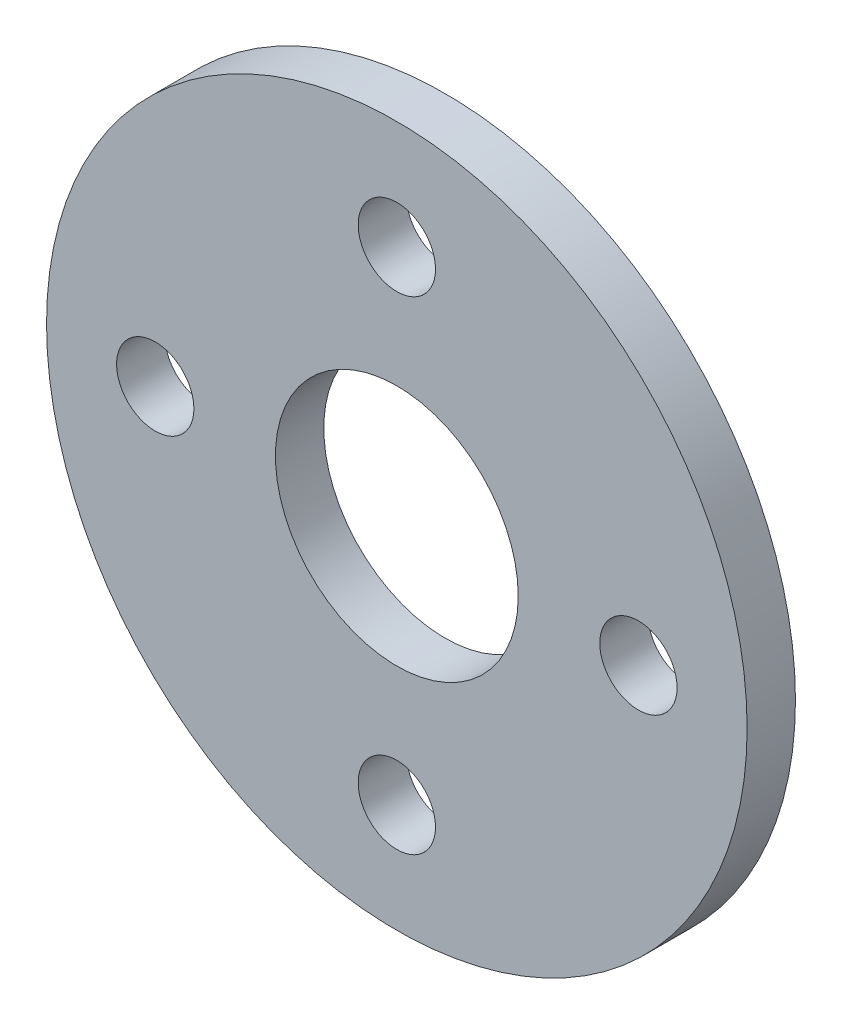
ISO-10303-21;
HEADER;
FILE_DESCRIPTION(('STEP AP214'),'2;1');
FILE_NAME('part.step','',(''),(''),'','','');
FILE_SCHEMA(('AUTOMOTIVE_DESIGN { 1 0 10303 214 1 1 1 1 }'));
ENDSEC;
DATA;
#1=APPLICATION_CONTEXT('core data for automotive mechanical design processes');
#2=APPLICATION_PROTOCOL_DEFINITION('international standard','automotive_design',2000,#1);
#3=PRODUCT_CONTEXT('',#1,'mechanical');
#4=PRODUCT('Part','Part','',(#3));
#5=PRODUCT_RELATED_PRODUCT_CATEGORY('part','',(#4));
#6=PRODUCT_DEFINITION_FORMATION('','',#4);
#7=PRODUCT_DEFINITION_CONTEXT('part definition',#1,'design');
#8=PRODUCT_DEFINITION('design','',#6,#7);
#9=PRODUCT_DEFINITION_SHAPE('','',#8);
#10=(LENGTH_UNIT() NAMED_UNIT(*) SI_UNIT(.MILLI.,.METRE.));
#11=(NAMED_UNIT(*) PLANE_ANGLE_UNIT() SI_UNIT($,.RADIAN.));
#12=(NAMED_UNIT(*) SI_UNIT($,.STERADIAN.) SOLID_ANGLE_UNIT());
#13=UNCERTAINTY_MEASURE_WITH_UNIT(LENGTH_MEASURE(1.E-05),#10,'distance_accuracy_value','');
#14=(GEOMETRIC_REPRESENTATION_CONTEXT(3) GLOBAL_UNCERTAINTY_ASSIGNED_CONTEXT((#13)) GLOBAL_UNIT_ASSIGNED_CONTEXT((#10,
#11,#12)) REPRESENTATION_CONTEXT('',''));
#15=CARTESIAN_POINT('',(0.,0.,0.));
#16=DIRECTION('',(0.,0.,1.));
#17=DIRECTION('',(1.,0.,0.));
#18=AXIS2_PLACEMENT_3D('',#15,#16,#17);
#19=CARTESIAN_POINT('',(0.,0.,2.));
#20=DIRECTION('',(0.,0.,1.));
#21=DIRECTION('',(1.,0.,0.));
#22=AXIS2_PLACEMENT_3D('',#19,#20,#21);
#23=PLANE('',#22);
#24=CARTESIAN_POINT('',(0.,-10.,2.));
#25=DIRECTION('',(0.,0.,1.));
#26=DIRECTION('',(1.,0.,0.));
#27=AXIS2_PLACEMENT_3D('',#24,#25,#26);
#28=CIRCLE('',#27,1.6);
#29=CARTESIAN_POINT('',(1.59999999999993,-10.,2.));
#30=VERTEX_POINT('',#29);
#31=EDGE_CURVE('E59',#30,#30,#28,.T.);
#32=ORIENTED_EDGE('',*,*,#31,.F.);
#33=EDGE_LOOP('',(#32));
#34=FACE_BOUND('',#33,.T.);
#35=CARTESIAN_POINT('',(0.,0.,2.));
#36=DIRECTION('',(0.,0.,1.));
#37=DIRECTION('',(1.,0.,0.));
#38=AXIS2_PLACEMENT_3D('',#35,#36,#37);
#39=CIRCLE('',#38,5.025);
#40=CARTESIAN_POINT('',(5.025,0.,2.));
#41=VERTEX_POINT('',#40);
#42=EDGE_CURVE('E47',#41,#41,#39,.T.);
#43=ORIENTED_EDGE('',*,*,#42,.F.);
#44=EDGE_LOOP('',(#43));
#45=FACE_BOUND('',#44,.T.);
#46=CARTESIAN_POINT('',(0.,0.,2.));
#47=DIRECTION('',(0.,0.,1.));
#48=DIRECTION('',(1.,0.,0.));
#49=AXIS2_PLACEMENT_3D('',#46,#47,#48);
#50=CIRCLE('',#49,14.5);
#51=CARTESIAN_POINT('',(14.5,0.,2.));
#52=VERTEX_POINT('',#51);
#53=EDGE_CURVE('E10',#52,#52,#50,.T.);
#54=ORIENTED_EDGE('',*,*,#53,.T.);
#55=EDGE_LOOP('',(#54));
#56=FACE_BOUND('',#55,.T.);
#57=CARTESIAN_POINT('',(0.,10.,2.));
#58=DIRECTION('',(0.,0.,1.));
#59=DIRECTION('',(1.,0.,0.));
#60=AXIS2_PLACEMENT_3D('',#57,#58,#59);
#61=CIRCLE('',#60,1.6);
#62=CARTESIAN_POINT('',(1.6,10.,2.));
#63=VERTEX_POINT('',#62);
#64=EDGE_CURVE('E42',#63,#63,#61,.T.);
#65=ORIENTED_EDGE('',*,*,#64,.F.);
#66=EDGE_LOOP('',(#65));
#67=FACE_BOUND('',#66,.T.);
#68=CARTESIAN_POINT('',(10.,0.,2.));
#69=DIRECTION('',(0.,0.,1.));
#70=DIRECTION('',(1.,0.,0.));
#71=AXIS2_PLACEMENT_3D('',#68,#69,#70);
#72=CIRCLE('',#71,1.6);
#73=CARTESIAN_POINT('',(11.6,0.,2.));
#74=VERTEX_POINT('',#73);
#75=EDGE_CURVE('E53',#74,#74,#72,.T.);
#76=ORIENTED_EDGE('',*,*,#75,.F.);
#77=EDGE_LOOP('',(#76));
#78=FACE_BOUND('',#77,.T.);
#79=CARTESIAN_POINT('',(-10.,1.04303567317601E-13,2.));
#80=DIRECTION('',(0.,0.,1.));
#81=DIRECTION('',(1.,0.,0.));
#82=AXIS2_PLACEMENT_3D('',#79,#80,#81);
#83=CIRCLE('',#82,1.6);
#84=CARTESIAN_POINT('',(-8.4,1.04303567317601E-13,2.));
#85=VERTEX_POINT('',#84);
#86=EDGE_CURVE('E65',#85,#85,#83,.T.);
#87=ORIENTED_EDGE('',*,*,#86,.F.);
#88=EDGE_LOOP('',(#87));
#89=FACE_BOUND('',#88,.T.);
#90=ADVANCED_FACE('F31',(#34,#45,#56,#67,#78,#89),#23,.T.);
#91=CARTESIAN_POINT('',(0.,0.,0.));
#92=DIRECTION('',(0.,0.,1.));
#93=DIRECTION('',(1.,0.,0.));
#94=AXIS2_PLACEMENT_3D('',#91,#92,#93);
#95=PLANE('',#94);
#96=CARTESIAN_POINT('',(0.,0.,0.));
#97=DIRECTION('',(0.,0.,1.));
#98=DIRECTION('',(1.,0.,0.));
#99=AXIS2_PLACEMENT_3D('',#96,#97,#98);
#100=CIRCLE('',#99,14.5);
#101=CARTESIAN_POINT('',(14.5,0.,0.));
#102=VERTEX_POINT('',#101);
#103=EDGE_CURVE('E35',#102,#102,#100,.T.);
#104=ORIENTED_EDGE('',*,*,#103,.F.);
#105=EDGE_LOOP('',(#104));
#106=FACE_BOUND('',#105,.T.);
#107=CARTESIAN_POINT('',(0.,10.,0.));
#108=DIRECTION('',(0.,0.,1.));
#109=DIRECTION('',(1.,0.,0.));
#110=AXIS2_PLACEMENT_3D('',#107,#108,#109);
#111=CIRCLE('',#110,1.6);
#112=CARTESIAN_POINT('',(1.6,10.,0.));
#113=VERTEX_POINT('',#112);
#114=EDGE_CURVE('E44',#113,#113,#111,.T.);
#115=ORIENTED_EDGE('',*,*,#114,.T.);
#116=EDGE_LOOP('',(#115));
#117=FACE_BOUND('',#116,.T.);
#118=CARTESIAN_POINT('',(0.,0.,0.));
#119=DIRECTION('',(0.,0.,1.));
#120=DIRECTION('',(1.,0.,0.));
#121=AXIS2_PLACEMENT_3D('',#118,#119,#120);
#122=CIRCLE('',#121,5.025);
#123=CARTESIAN_POINT('',(5.025,0.,0.));
#124=VERTEX_POINT('',#123);
#125=EDGE_CURVE('E50',#124,#124,#122,.T.);
#126=ORIENTED_EDGE('',*,*,#125,.T.);
#127=EDGE_LOOP('',(#126));
#128=FACE_BOUND('',#127,.T.);
#129=CARTESIAN_POINT('',(10.,0.,0.));
#130=DIRECTION('',(0.,0.,1.));
#131=DIRECTION('',(1.,0.,0.));
#132=AXIS2_PLACEMENT_3D('',#129,#130,#131);
#133=CIRCLE('',#132,1.6);
#134=CARTESIAN_POINT('',(11.6,0.,0.));
#135=VERTEX_POINT('',#134);
#136=EDGE_CURVE('E56',#135,#135,#133,.T.);
#137=ORIENTED_EDGE('',*,*,#136,.T.);
#138=EDGE_LOOP('',(#137));
#139=FACE_BOUND('',#138,.T.);
#140=CARTESIAN_POINT('',(0.,-10.,0.));
#141=DIRECTION('',(0.,0.,1.));
#142=DIRECTION('',(1.,0.,0.));
#143=AXIS2_PLACEMENT_3D('',#140,#141,#142);
#144=CIRCLE('',#143,1.6);
#145=CARTESIAN_POINT('',(1.59999999999993,-10.,0.));
#146=VERTEX_POINT('',#145);
#147=EDGE_CURVE('E62',#146,#146,#144,.T.);
#148=ORIENTED_EDGE('',*,*,#147,.T.);
#149=EDGE_LOOP('',(#148));
#150=FACE_BOUND('',#149,.T.);
#151=CARTESIAN_POINT('',(-10.,1.04303567317601E-13,0.));
#152=DIRECTION('',(0.,0.,1.));
#153=DIRECTION('',(1.,0.,0.));
#154=AXIS2_PLACEMENT_3D('',#151,#152,#153);
#155=CIRCLE('',#154,1.6);
#156=CARTESIAN_POINT('',(-8.4,1.04303567317601E-13,0.));
#157=VERTEX_POINT('',#156);
#158=EDGE_CURVE('E68',#157,#157,#155,.T.);
#159=ORIENTED_EDGE('',*,*,#158,.T.);
#160=EDGE_LOOP('',(#159));
#161=FACE_BOUND('',#160,.T.);
#162=ADVANCED_FACE('F78',(#106,#117,#128,#139,#150,#161),#95,.F.);
#163=CARTESIAN_POINT('',(0.,0.,2.));
#164=DIRECTION('',(0.,0.,-1.));
#165=DIRECTION('',(-1.,0.,0.));
#166=AXIS2_PLACEMENT_3D('',#163,#164,#165);
#167=CYLINDRICAL_SURFACE('',#166,14.5);
#168=ORIENTED_EDGE('',*,*,#53,.F.);
#169=EDGE_LOOP('',(#168));
#170=FACE_BOUND('',#169,.T.);
#171=ORIENTED_EDGE('',*,*,#103,.T.);
#172=EDGE_LOOP('',(#171));
#173=FACE_BOUND('',#172,.T.);
#174=ADVANCED_FACE('F33',(#170,#173),#167,.T.);
#175=CARTESIAN_POINT('',(0.,10.,2.));
#176=DIRECTION('',(0.,0.,-1.));
#177=DIRECTION('',(-1.,0.,0.));
#178=AXIS2_PLACEMENT_3D('',#175,#176,#177);
#179=CYLINDRICAL_SURFACE('',#178,1.6);
#180=ORIENTED_EDGE('',*,*,#64,.T.);
#181=EDGE_LOOP('',(#180));
#182=FACE_BOUND('',#181,.T.);
#183=ORIENTED_EDGE('',*,*,#114,.F.);
#184=EDGE_LOOP('',(#183));
#185=FACE_BOUND('',#184,.T.);
#186=ADVANCED_FACE('F88',(#182,#185),#179,.F.);
#187=CARTESIAN_POINT('',(0.,0.,2.));
#188=DIRECTION('',(0.,0.,-1.));
#189=DIRECTION('',(-1.,0.,0.));
#190=AXIS2_PLACEMENT_3D('',#187,#188,#189);
#191=CYLINDRICAL_SURFACE('',#190,5.025);
#192=ORIENTED_EDGE('',*,*,#42,.T.);
#193=EDGE_LOOP('',(#192));
#194=FACE_BOUND('',#193,.T.);
#195=ORIENTED_EDGE('',*,*,#125,.F.);
#196=EDGE_LOOP('',(#195));
#197=FACE_BOUND('',#196,.T.);
#198=ADVANCED_FACE('F91',(#194,#197),#191,.F.);
#199=CARTESIAN_POINT('',(10.,0.,2.));
#200=DIRECTION('',(0.,0.,-1.));
#201=DIRECTION('',(-1.,0.,0.));
#202=AXIS2_PLACEMENT_3D('',#199,#200,#201);
#203=CYLINDRICAL_SURFACE('',#202,1.6);
#204=ORIENTED_EDGE('',*,*,#75,.T.);
#205=EDGE_LOOP('',(#204));
#206=FACE_BOUND('',#205,.T.);
#207=ORIENTED_EDGE('',*,*,#136,.F.);
#208=EDGE_LOOP('',(#207));
#209=FACE_BOUND('',#208,.T.);
#210=ADVANCED_FACE('F95',(#206,#209),#203,.F.);
#211=CARTESIAN_POINT('',(0.,-10.,2.));
#212=DIRECTION('',(0.,0.,-1.));
#213=DIRECTION('',(-1.,0.,0.));
#214=AXIS2_PLACEMENT_3D('',#211,#212,#213);
#215=CYLINDRICAL_SURFACE('',#214,1.6);
#216=ORIENTED_EDGE('',*,*,#31,.T.);
#217=EDGE_LOOP('',(#216));
#218=FACE_BOUND('',#217,.T.);
#219=ORIENTED_EDGE('',*,*,#147,.F.);
#220=EDGE_LOOP('',(#219));
#221=FACE_BOUND('',#220,.T.);
#222=ADVANCED_FACE('F99',(#218,#221),#215,.F.);
#223=CARTESIAN_POINT('',(-10.,1.04303567317601E-13,2.));
#224=DIRECTION('',(0.,0.,-1.));
#225=DIRECTION('',(-1.,0.,0.));
#226=AXIS2_PLACEMENT_3D('',#223,#224,#225);
#227=CYLINDRICAL_SURFACE('',#226,1.6);
#228=ORIENTED_EDGE('',*,*,#86,.T.);
#229=EDGE_LOOP('',(#228));
#230=FACE_BOUND('',#229,.T.);
#231=ORIENTED_EDGE('',*,*,#158,.F.);
#232=EDGE_LOOP('',(#231));
#233=FACE_BOUND('',#232,.T.);
#234=ADVANCED_FACE('F74',(#230,#233),#227,.F.);
#235=CLOSED_SHELL('',(#90,#162,#174,#186,#198,#210,#222,#234));
#236=MANIFOLD_SOLID_BREP('B2',#235);
#237=ADVANCED_BREP_SHAPE_REPRESENTATION('',(#18,#236),#14);
#238=SHAPE_DEFINITION_REPRESENTATION(#9,#237);
ENDSEC;
END-ISO-10303-21;
